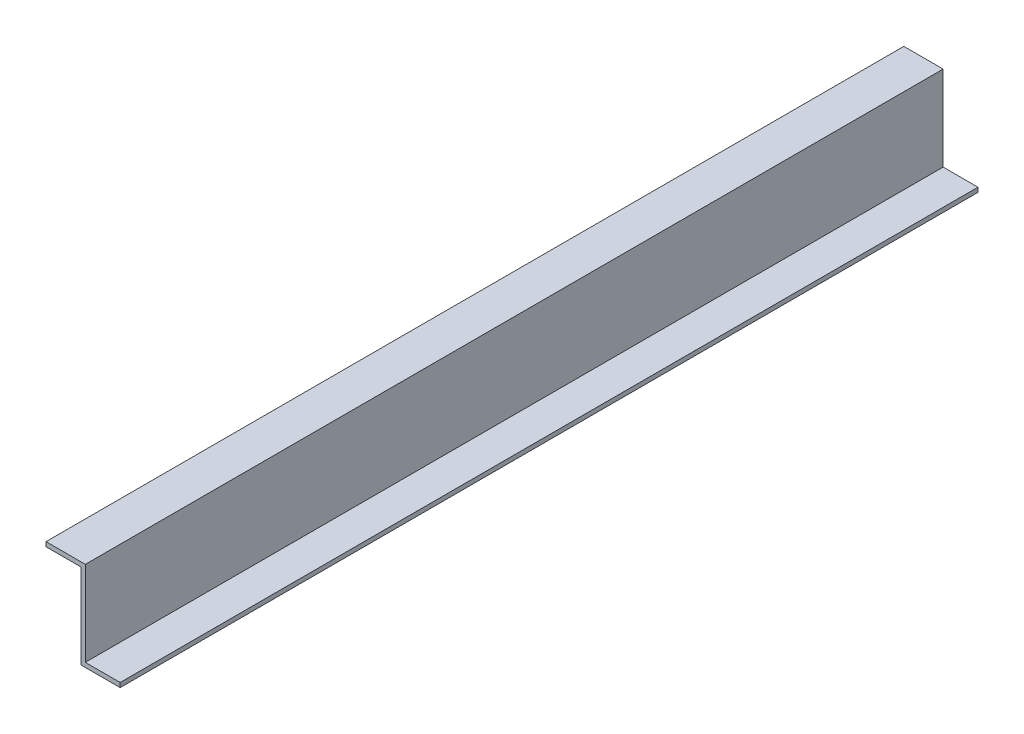
ISO-10303-21;
HEADER;
FILE_DESCRIPTION(('STEP AP214'),'2;1');
FILE_NAME('part.step','',(''),(''),'','','');
FILE_SCHEMA(('AUTOMOTIVE_DESIGN { 1 0 10303 214 1 1 1 1 }'));
ENDSEC;
DATA;
#1=APPLICATION_CONTEXT('core data for automotive mechanical design processes');
#2=APPLICATION_PROTOCOL_DEFINITION('international standard','automotive_design',2000,#1);
#3=PRODUCT_CONTEXT('',#1,'mechanical');
#4=PRODUCT('Part','Part','',(#3));
#5=PRODUCT_RELATED_PRODUCT_CATEGORY('part','',(#4));
#6=PRODUCT_DEFINITION_FORMATION('','',#4);
#7=PRODUCT_DEFINITION_CONTEXT('part definition',#1,'design');
#8=PRODUCT_DEFINITION('design','',#6,#7);
#9=PRODUCT_DEFINITION_SHAPE('','',#8);
#10=(LENGTH_UNIT() NAMED_UNIT(*) SI_UNIT(.MILLI.,.METRE.));
#11=(NAMED_UNIT(*) PLANE_ANGLE_UNIT() SI_UNIT($,.RADIAN.));
#12=(NAMED_UNIT(*) SI_UNIT($,.STERADIAN.) SOLID_ANGLE_UNIT());
#13=UNCERTAINTY_MEASURE_WITH_UNIT(LENGTH_MEASURE(1.E-05),#10,'distance_accuracy_value','');
#14=(GEOMETRIC_REPRESENTATION_CONTEXT(3) GLOBAL_UNCERTAINTY_ASSIGNED_CONTEXT((#13)) GLOBAL_UNIT_ASSIGNED_CONTEXT((#10,
#11,#12)) REPRESENTATION_CONTEXT('',''));
#15=CARTESIAN_POINT('',(0.,0.,0.));
#16=DIRECTION('',(0.,0.,1.));
#17=DIRECTION('',(1.,0.,0.));
#18=AXIS2_PLACEMENT_3D('',#15,#16,#17);
#19=CARTESIAN_POINT('',(0.79375,-14.2875,152.4));
#20=DIRECTION('',(0.,-1.,0.));
#21=DIRECTION('',(0.,0.,-1.));
#22=AXIS2_PLACEMENT_3D('',#19,#20,#21);
#23=PLANE('',#22);
#24=DIRECTION('',(0.,0.,-1.));
#25=VECTOR('',#24,1.);
#26=CARTESIAN_POINT('',(13.17625,-14.2875,152.4));
#27=LINE('',#26,#25);
#28=CARTESIAN_POINT('',(13.17625,-14.2875,152.4));
#29=VERTEX_POINT('',#28);
#30=CARTESIAN_POINT('',(13.17625,-14.2875,-152.4));
#31=VERTEX_POINT('',#30);
#32=EDGE_CURVE('E129',#29,#31,#27,.T.);
#33=ORIENTED_EDGE('',*,*,#32,.T.);
#34=DIRECTION('',(-1.,0.,0.));
#35=VECTOR('',#34,1.);
#36=CARTESIAN_POINT('',(0.79375,-14.2875,-152.4));
#37=LINE('',#36,#35);
#38=CARTESIAN_POINT('',(0.79375,-14.2875,-152.4));
#39=VERTEX_POINT('',#38);
#40=EDGE_CURVE('E122',#31,#39,#37,.T.);
#41=ORIENTED_EDGE('',*,*,#40,.T.);
#42=DIRECTION('',(0.,0.,-1.));
#43=VECTOR('',#42,1.);
#44=CARTESIAN_POINT('',(0.79375,-14.2875,152.4));
#45=LINE('',#44,#43);
#46=CARTESIAN_POINT('',(0.79375,-14.2875,152.4));
#47=VERTEX_POINT('',#46);
#48=EDGE_CURVE('E11',#47,#39,#45,.T.);
#49=ORIENTED_EDGE('',*,*,#48,.F.);
#50=DIRECTION('',(-1.,0.,0.));
#51=VECTOR('',#50,1.);
#52=CARTESIAN_POINT('',(0.79375,-14.2875,152.4));
#53=LINE('',#52,#51);
#54=EDGE_CURVE('E154',#29,#47,#53,.T.);
#55=ORIENTED_EDGE('',*,*,#54,.F.);
#56=EDGE_LOOP('',(#33,#41,#49,#55));
#57=FACE_BOUND('',#56,.T.);
#58=ADVANCED_FACE('F45',(#57),#23,.F.);
#59=CARTESIAN_POINT('',(0.79375,-14.2875,152.4));
#60=DIRECTION('',(-1.,0.,0.));
#61=DIRECTION('',(0.,0.,1.));
#62=AXIS2_PLACEMENT_3D('',#59,#60,#61);
#63=PLANE('',#62);
#64=ORIENTED_EDGE('',*,*,#48,.T.);
#65=DIRECTION('',(0.,1.,0.));
#66=VECTOR('',#65,1.);
#67=CARTESIAN_POINT('',(0.79375,-14.2875,-152.4));
#68=LINE('',#67,#66);
#69=CARTESIAN_POINT('',(0.79375,15.875,-152.4));
#70=VERTEX_POINT('',#69);
#71=EDGE_CURVE('E112',#39,#70,#68,.T.);
#72=ORIENTED_EDGE('',*,*,#71,.T.);
#73=DIRECTION('',(0.,0.,-1.));
#74=VECTOR('',#73,1.);
#75=CARTESIAN_POINT('',(0.79375,15.875,152.4));
#76=LINE('',#75,#74);
#77=CARTESIAN_POINT('',(0.79375,15.875,152.4));
#78=VERTEX_POINT('',#77);
#79=EDGE_CURVE('E53',#78,#70,#76,.T.);
#80=ORIENTED_EDGE('',*,*,#79,.F.);
#81=DIRECTION('',(0.,1.,0.));
#82=VECTOR('',#81,1.);
#83=CARTESIAN_POINT('',(0.79375,-14.2875,152.4));
#84=LINE('',#83,#82);
#85=EDGE_CURVE('E113',#47,#78,#84,.T.);
#86=ORIENTED_EDGE('',*,*,#85,.F.);
#87=EDGE_LOOP('',(#64,#72,#80,#86));
#88=FACE_BOUND('',#87,.T.);
#89=ADVANCED_FACE('F110',(#88),#63,.F.);
#90=CARTESIAN_POINT('',(0.79375,15.875,152.4));
#91=DIRECTION('',(0.,-1.,0.));
#92=DIRECTION('',(0.,0.,-1.));
#93=AXIS2_PLACEMENT_3D('',#90,#91,#92);
#94=PLANE('',#93);
#95=ORIENTED_EDGE('',*,*,#79,.T.);
#96=DIRECTION('',(-1.,0.,0.));
#97=VECTOR('',#96,1.);
#98=CARTESIAN_POINT('',(0.79375,15.875,-152.4));
#99=LINE('',#98,#97);
#100=CARTESIAN_POINT('',(-13.17625,15.875,-152.4));
#101=VERTEX_POINT('',#100);
#102=EDGE_CURVE('E126',#70,#101,#99,.T.);
#103=ORIENTED_EDGE('',*,*,#102,.T.);
#104=DIRECTION('',(0.,0.,-1.));
#105=VECTOR('',#104,1.);
#106=CARTESIAN_POINT('',(-13.17625,15.875,152.4));
#107=LINE('',#106,#105);
#108=CARTESIAN_POINT('',(-13.17625,15.875,152.4));
#109=VERTEX_POINT('',#108);
#110=EDGE_CURVE('E189',#109,#101,#107,.T.);
#111=ORIENTED_EDGE('',*,*,#110,.F.);
#112=DIRECTION('',(-1.,0.,0.));
#113=VECTOR('',#112,1.);
#114=CARTESIAN_POINT('',(0.79375,15.875,152.4));
#115=LINE('',#114,#113);
#116=EDGE_CURVE('E159',#78,#109,#115,.T.);
#117=ORIENTED_EDGE('',*,*,#116,.F.);
#118=EDGE_LOOP('',(#95,#103,#111,#117));
#119=FACE_BOUND('',#118,.T.);
#120=ADVANCED_FACE('F194',(#119),#94,.F.);
#121=CARTESIAN_POINT('',(-13.17625,15.875,152.4));
#122=DIRECTION('',(1.,0.,0.));
#123=DIRECTION('',(0.,0.,-1.));
#124=AXIS2_PLACEMENT_3D('',#121,#122,#123);
#125=PLANE('',#124);
#126=ORIENTED_EDGE('',*,*,#110,.T.);
#127=DIRECTION('',(0.,-1.,0.));
#128=VECTOR('',#127,1.);
#129=CARTESIAN_POINT('',(-13.17625,15.875,-152.4));
#130=LINE('',#129,#128);
#131=CARTESIAN_POINT('',(-13.17625,14.2875,-152.4));
#132=VERTEX_POINT('',#131);
#133=EDGE_CURVE('E135',#101,#132,#130,.T.);
#134=ORIENTED_EDGE('',*,*,#133,.T.);
#135=DIRECTION('',(0.,0.,-1.));
#136=VECTOR('',#135,1.);
#137=CARTESIAN_POINT('',(-13.17625,14.2875,152.4));
#138=LINE('',#137,#136);
#139=CARTESIAN_POINT('',(-13.17625,14.2875,152.4));
#140=VERTEX_POINT('',#139);
#141=EDGE_CURVE('E186',#140,#132,#138,.T.);
#142=ORIENTED_EDGE('',*,*,#141,.F.);
#143=DIRECTION('',(0.,-1.,0.));
#144=VECTOR('',#143,1.);
#145=CARTESIAN_POINT('',(-13.17625,15.875,152.4));
#146=LINE('',#145,#144);
#147=EDGE_CURVE('E162',#109,#140,#146,.T.);
#148=ORIENTED_EDGE('',*,*,#147,.F.);
#149=EDGE_LOOP('',(#126,#134,#142,#148));
#150=FACE_BOUND('',#149,.T.);
#151=ADVANCED_FACE('F202',(#150),#125,.F.);
#152=CARTESIAN_POINT('',(-0.79375,14.2875,152.4));
#153=DIRECTION('',(0.,1.,0.));
#154=DIRECTION('',(0.,0.,1.));
#155=AXIS2_PLACEMENT_3D('',#152,#153,#154);
#156=PLANE('',#155);
#157=ORIENTED_EDGE('',*,*,#141,.T.);
#158=DIRECTION('',(1.,0.,0.));
#159=VECTOR('',#158,1.);
#160=CARTESIAN_POINT('',(-0.79375,14.2875,-152.4));
#161=LINE('',#160,#159);
#162=CARTESIAN_POINT('',(-0.79375,14.2875,-152.4));
#163=VERTEX_POINT('',#162);
#164=EDGE_CURVE('E139',#132,#163,#161,.T.);
#165=ORIENTED_EDGE('',*,*,#164,.T.);
#166=DIRECTION('',(0.,0.,-1.));
#167=VECTOR('',#166,1.);
#168=CARTESIAN_POINT('',(-0.79375,14.2875,152.4));
#169=LINE('',#168,#167);
#170=CARTESIAN_POINT('',(-0.79375,14.2875,152.4));
#171=VERTEX_POINT('',#170);
#172=EDGE_CURVE('E183',#171,#163,#169,.T.);
#173=ORIENTED_EDGE('',*,*,#172,.F.);
#174=DIRECTION('',(1.,0.,0.));
#175=VECTOR('',#174,1.);
#176=CARTESIAN_POINT('',(-0.79375,14.2875,152.4));
#177=LINE('',#176,#175);
#178=EDGE_CURVE('E165',#140,#171,#177,.T.);
#179=ORIENTED_EDGE('',*,*,#178,.F.);
#180=EDGE_LOOP('',(#157,#165,#173,#179));
#181=FACE_BOUND('',#180,.T.);
#182=ADVANCED_FACE('F205',(#181),#156,.F.);
#183=CARTESIAN_POINT('',(-0.79375,-15.875,152.4));
#184=DIRECTION('',(1.,0.,0.));
#185=DIRECTION('',(0.,0.,-1.));
#186=AXIS2_PLACEMENT_3D('',#183,#184,#185);
#187=PLANE('',#186);
#188=ORIENTED_EDGE('',*,*,#172,.T.);
#189=DIRECTION('',(0.,-1.,0.));
#190=VECTOR('',#189,1.);
#191=CARTESIAN_POINT('',(-0.79375,-15.875,-152.4));
#192=LINE('',#191,#190);
#193=CARTESIAN_POINT('',(-0.79375,-15.875,-152.4));
#194=VERTEX_POINT('',#193);
#195=EDGE_CURVE('E143',#163,#194,#192,.T.);
#196=ORIENTED_EDGE('',*,*,#195,.T.);
#197=DIRECTION('',(0.,0.,-1.));
#198=VECTOR('',#197,1.);
#199=CARTESIAN_POINT('',(-0.79375,-15.875,152.4));
#200=LINE('',#199,#198);
#201=CARTESIAN_POINT('',(-0.79375,-15.875,152.4));
#202=VERTEX_POINT('',#201);
#203=EDGE_CURVE('E180',#202,#194,#200,.T.);
#204=ORIENTED_EDGE('',*,*,#203,.F.);
#205=DIRECTION('',(0.,-1.,0.));
#206=VECTOR('',#205,1.);
#207=CARTESIAN_POINT('',(-0.79375,-15.875,152.4));
#208=LINE('',#207,#206);
#209=EDGE_CURVE('E168',#171,#202,#208,.T.);
#210=ORIENTED_EDGE('',*,*,#209,.F.);
#211=EDGE_LOOP('',(#188,#196,#204,#210));
#212=FACE_BOUND('',#211,.T.);
#213=ADVANCED_FACE('F210',(#212),#187,.F.);
#214=CARTESIAN_POINT('',(-0.79375,-15.875,152.4));
#215=DIRECTION('',(0.,1.,0.));
#216=DIRECTION('',(0.,0.,1.));
#217=AXIS2_PLACEMENT_3D('',#214,#215,#216);
#218=PLANE('',#217);
#219=ORIENTED_EDGE('',*,*,#203,.T.);
#220=DIRECTION('',(1.,0.,0.));
#221=VECTOR('',#220,1.);
#222=CARTESIAN_POINT('',(-0.79375,-15.875,-152.4));
#223=LINE('',#222,#221);
#224=CARTESIAN_POINT('',(13.17625,-15.875,-152.4));
#225=VERTEX_POINT('',#224);
#226=EDGE_CURVE('E147',#194,#225,#223,.T.);
#227=ORIENTED_EDGE('',*,*,#226,.T.);
#228=DIRECTION('',(0.,0.,-1.));
#229=VECTOR('',#228,1.);
#230=CARTESIAN_POINT('',(13.17625,-15.875,152.4));
#231=LINE('',#230,#229);
#232=CARTESIAN_POINT('',(13.17625,-15.875,152.4));
#233=VERTEX_POINT('',#232);
#234=EDGE_CURVE('E177',#233,#225,#231,.T.);
#235=ORIENTED_EDGE('',*,*,#234,.F.);
#236=DIRECTION('',(1.,0.,0.));
#237=VECTOR('',#236,1.);
#238=CARTESIAN_POINT('',(-0.79375,-15.875,152.4));
#239=LINE('',#238,#237);
#240=EDGE_CURVE('E65',#202,#233,#239,.T.);
#241=ORIENTED_EDGE('',*,*,#240,.F.);
#242=EDGE_LOOP('',(#219,#227,#235,#241));
#243=FACE_BOUND('',#242,.T.);
#244=ADVANCED_FACE('F213',(#243),#218,.F.);
#245=CARTESIAN_POINT('',(13.17625,-14.2875,152.4));
#246=DIRECTION('',(-1.,0.,0.));
#247=DIRECTION('',(0.,0.,1.));
#248=AXIS2_PLACEMENT_3D('',#245,#246,#247);
#249=PLANE('',#248);
#250=ORIENTED_EDGE('',*,*,#234,.T.);
#251=DIRECTION('',(0.,1.,0.));
#252=VECTOR('',#251,1.);
#253=CARTESIAN_POINT('',(13.17625,-14.2875,-152.4));
#254=LINE('',#253,#252);
#255=EDGE_CURVE('E151',#225,#31,#254,.T.);
#256=ORIENTED_EDGE('',*,*,#255,.T.);
#257=ORIENTED_EDGE('',*,*,#32,.F.);
#258=DIRECTION('',(0.,1.,0.));
#259=VECTOR('',#258,1.);
#260=CARTESIAN_POINT('',(13.17625,-14.2875,152.4));
#261=LINE('',#260,#259);
#262=EDGE_CURVE('E60',#233,#29,#261,.T.);
#263=ORIENTED_EDGE('',*,*,#262,.F.);
#264=EDGE_LOOP('',(#250,#256,#257,#263));
#265=FACE_BOUND('',#264,.T.);
#266=ADVANCED_FACE('F215',(#265),#249,.F.);
#267=CARTESIAN_POINT('',(0.,0.,152.4));
#268=DIRECTION('',(0.,0.,-1.));
#269=DIRECTION('',(-1.,0.,0.));
#270=AXIS2_PLACEMENT_3D('',#267,#268,#269);
#271=PLANE('',#270);
#272=ORIENTED_EDGE('',*,*,#54,.T.);
#273=ORIENTED_EDGE('',*,*,#85,.T.);
#274=ORIENTED_EDGE('',*,*,#116,.T.);
#275=ORIENTED_EDGE('',*,*,#147,.T.);
#276=ORIENTED_EDGE('',*,*,#178,.T.);
#277=ORIENTED_EDGE('',*,*,#209,.T.);
#278=ORIENTED_EDGE('',*,*,#240,.T.);
#279=ORIENTED_EDGE('',*,*,#262,.T.);
#280=EDGE_LOOP('',(#272,#273,#274,#275,#276,#277,#278,#279));
#281=FACE_BOUND('',#280,.T.);
#282=ADVANCED_FACE('F197',(#281),#271,.F.);
#283=CARTESIAN_POINT('',(0.,0.,-152.4));
#284=DIRECTION('',(0.,0.,-1.));
#285=DIRECTION('',(-1.,0.,0.));
#286=AXIS2_PLACEMENT_3D('',#283,#284,#285);
#287=PLANE('',#286);
#288=ORIENTED_EDGE('',*,*,#40,.F.);
#289=ORIENTED_EDGE('',*,*,#255,.F.);
#290=ORIENTED_EDGE('',*,*,#226,.F.);
#291=ORIENTED_EDGE('',*,*,#195,.F.);
#292=ORIENTED_EDGE('',*,*,#164,.F.);
#293=ORIENTED_EDGE('',*,*,#133,.F.);
#294=ORIENTED_EDGE('',*,*,#102,.F.);
#295=ORIENTED_EDGE('',*,*,#71,.F.);
#296=EDGE_LOOP('',(#288,#289,#290,#291,#292,#293,#294,#295));
#297=FACE_BOUND('',#296,.T.);
#298=ADVANCED_FACE('F120',(#297),#287,.T.);
#299=CLOSED_SHELL('',(#58,#89,#120,#151,#182,#213,#244,#266,#282,#298));
#300=MANIFOLD_SOLID_BREP('B2',#299);
#301=ADVANCED_BREP_SHAPE_REPRESENTATION('',(#18,#300),#14);
#302=SHAPE_DEFINITION_REPRESENTATION(#9,#301);
ENDSEC;
END-ISO-10303-21;
